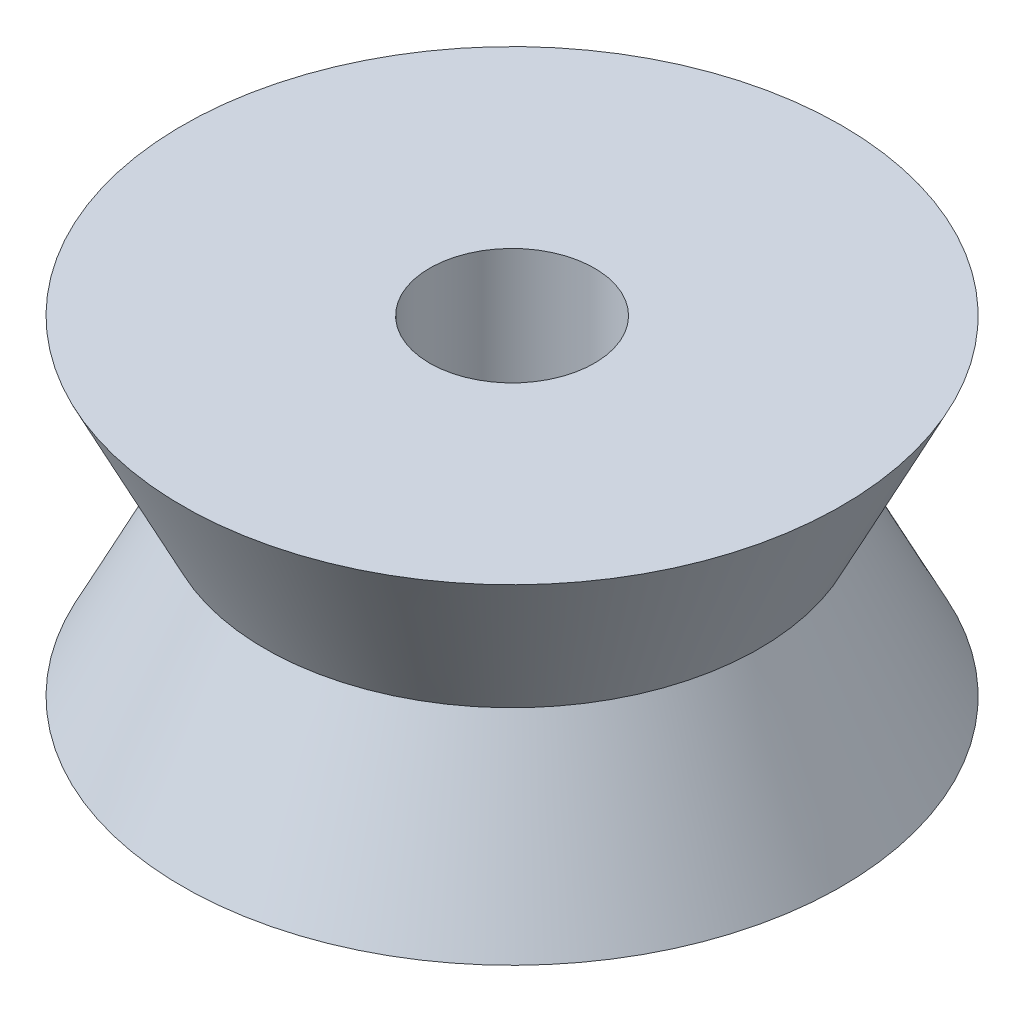
ISO-10303-21;
HEADER;
FILE_DESCRIPTION(('STEP AP214'),'2;1');
FILE_NAME('part.step','',(''),(''),'','','');
FILE_SCHEMA(('AUTOMOTIVE_DESIGN { 1 0 10303 214 1 1 1 1 }'));
ENDSEC;
DATA;
#1=APPLICATION_CONTEXT('core data for automotive mechanical design processes');
#2=APPLICATION_PROTOCOL_DEFINITION('international standard','automotive_design',2000,#1);
#3=PRODUCT_CONTEXT('',#1,'mechanical');
#4=PRODUCT('Part','Part','',(#3));
#5=PRODUCT_RELATED_PRODUCT_CATEGORY('part','',(#4));
#6=PRODUCT_DEFINITION_FORMATION('','',#4);
#7=PRODUCT_DEFINITION_CONTEXT('part definition',#1,'design');
#8=PRODUCT_DEFINITION('design','',#6,#7);
#9=PRODUCT_DEFINITION_SHAPE('','',#8);
#10=(LENGTH_UNIT() NAMED_UNIT(*) SI_UNIT(.MILLI.,.METRE.));
#11=(NAMED_UNIT(*) PLANE_ANGLE_UNIT() SI_UNIT($,.RADIAN.));
#12=(NAMED_UNIT(*) SI_UNIT($,.STERADIAN.) SOLID_ANGLE_UNIT());
#13=UNCERTAINTY_MEASURE_WITH_UNIT(LENGTH_MEASURE(1.E-05),#10,'distance_accuracy_value','');
#14=(GEOMETRIC_REPRESENTATION_CONTEXT(3) GLOBAL_UNCERTAINTY_ASSIGNED_CONTEXT((#13)) GLOBAL_UNIT_ASSIGNED_CONTEXT((#10,
#11,#12)) REPRESENTATION_CONTEXT('',''));
#15=CARTESIAN_POINT('',(0.,0.,0.));
#16=DIRECTION('',(0.,0.,1.));
#17=DIRECTION('',(1.,0.,0.));
#18=AXIS2_PLACEMENT_3D('',#15,#16,#17);
#19=CARTESIAN_POINT('',(0.,20.,0.));
#20=DIRECTION('',(0.,-1.,0.));
#21=DIRECTION('',(0.,0.,-1.));
#22=AXIS2_PLACEMENT_3D('',#19,#20,#21);
#23=PLANE('',#22);
#24=CARTESIAN_POINT('',(0.,20.,0.));
#25=DIRECTION('',(0.,1.,0.));
#26=DIRECTION('',(0.,0.,1.));
#27=AXIS2_PLACEMENT_3D('',#24,#25,#26);
#28=CIRCLE('',#27,5.);
#29=CARTESIAN_POINT('',(0.,20.,5.));
#30=VERTEX_POINT('',#29);
#31=EDGE_CURVE('E50',#30,#30,#28,.T.);
#32=ORIENTED_EDGE('',*,*,#31,.F.);
#33=EDGE_LOOP('',(#32));
#34=FACE_BOUND('',#33,.T.);
#35=CARTESIAN_POINT('',(0.,20.,0.));
#36=DIRECTION('',(0.,-1.,0.));
#37=DIRECTION('',(0.,0.,-1.));
#38=AXIS2_PLACEMENT_3D('',#35,#36,#37);
#39=CIRCLE('',#38,20.);
#40=CARTESIAN_POINT('',(0.,20.,-20.));
#41=VERTEX_POINT('',#40);
#42=EDGE_CURVE('E10',#41,#41,#39,.T.);
#43=ORIENTED_EDGE('',*,*,#42,.F.);
#44=EDGE_LOOP('',(#43));
#45=FACE_BOUND('',#44,.T.);
#46=ADVANCED_FACE('F33',(#34,#45),#23,.F.);
#47=CARTESIAN_POINT('',(0.,20.,0.));
#48=DIRECTION('',(0.,1.,0.));
#49=DIRECTION('',(0.,0.,1.));
#50=AXIS2_PLACEMENT_3D('',#47,#48,#49);
#51=CONICAL_SURFACE('',#50,20.,0.463647609000806);
#52=CARTESIAN_POINT('',(0.,10.,0.));
#53=DIRECTION('',(0.,-1.,0.));
#54=DIRECTION('',(0.,0.,-1.));
#55=AXIS2_PLACEMENT_3D('',#52,#53,#54);
#56=CIRCLE('',#55,15.);
#57=CARTESIAN_POINT('',(0.,10.,-15.));
#58=VERTEX_POINT('',#57);
#59=EDGE_CURVE('E39',#58,#58,#56,.T.);
#60=ORIENTED_EDGE('',*,*,#59,.F.);
#61=EDGE_LOOP('',(#60));
#62=FACE_BOUND('',#61,.T.);
#63=ORIENTED_EDGE('',*,*,#42,.T.);
#64=EDGE_LOOP('',(#63));
#65=FACE_BOUND('',#64,.T.);
#66=ADVANCED_FACE('F67',(#62,#65),#51,.T.);
#67=CARTESIAN_POINT('',(0.,10.,0.));
#68=DIRECTION('',(0.,-1.,0.));
#69=DIRECTION('',(0.,0.,-1.));
#70=AXIS2_PLACEMENT_3D('',#67,#68,#69);
#71=CONICAL_SURFACE('',#70,15.,0.463647609000806);
#72=CARTESIAN_POINT('',(0.,0.,0.));
#73=DIRECTION('',(0.,-1.,0.));
#74=DIRECTION('',(0.,0.,-1.));
#75=AXIS2_PLACEMENT_3D('',#72,#73,#74);
#76=CIRCLE('',#75,20.);
#77=CARTESIAN_POINT('',(0.,0.,-20.));
#78=VERTEX_POINT('',#77);
#79=EDGE_CURVE('E43',#78,#78,#76,.T.);
#80=ORIENTED_EDGE('',*,*,#79,.F.);
#81=EDGE_LOOP('',(#80));
#82=FACE_BOUND('',#81,.T.);
#83=ORIENTED_EDGE('',*,*,#59,.T.);
#84=EDGE_LOOP('',(#83));
#85=FACE_BOUND('',#84,.T.);
#86=ADVANCED_FACE('F71',(#82,#85),#71,.T.);
#87=CARTESIAN_POINT('',(0.,0.,0.));
#88=DIRECTION('',(0.,1.,0.));
#89=DIRECTION('',(0.,0.,1.));
#90=AXIS2_PLACEMENT_3D('',#87,#88,#89);
#91=PLANE('',#90);
#92=CARTESIAN_POINT('',(0.,0.,0.));
#93=DIRECTION('',(0.,1.,0.));
#94=DIRECTION('',(0.,0.,1.));
#95=AXIS2_PLACEMENT_3D('',#92,#93,#94);
#96=CIRCLE('',#95,5.);
#97=CARTESIAN_POINT('',(0.,0.,5.));
#98=VERTEX_POINT('',#97);
#99=EDGE_CURVE('E47',#98,#98,#96,.T.);
#100=ORIENTED_EDGE('',*,*,#99,.T.);
#101=EDGE_LOOP('',(#100));
#102=FACE_BOUND('',#101,.T.);
#103=ORIENTED_EDGE('',*,*,#79,.T.);
#104=EDGE_LOOP('',(#103));
#105=FACE_BOUND('',#104,.T.);
#106=ADVANCED_FACE('F56',(#102,#105),#91,.F.);
#107=CARTESIAN_POINT('',(0.,0.,0.));
#108=DIRECTION('',(0.,1.,0.));
#109=DIRECTION('',(0.,0.,1.));
#110=AXIS2_PLACEMENT_3D('',#107,#108,#109);
#111=CYLINDRICAL_SURFACE('',#110,5.);
#112=ORIENTED_EDGE('',*,*,#99,.F.);
#113=EDGE_LOOP('',(#112));
#114=FACE_BOUND('',#113,.T.);
#115=ORIENTED_EDGE('',*,*,#31,.T.);
#116=EDGE_LOOP('',(#115));
#117=FACE_BOUND('',#116,.T.);
#118=ADVANCED_FACE('F59',(#114,#117),#111,.F.);
#119=CLOSED_SHELL('',(#46,#66,#86,#106,#118));
#120=MANIFOLD_SOLID_BREP('B2',#119);
#121=ADVANCED_BREP_SHAPE_REPRESENTATION('',(#18,#120),#14);
#122=SHAPE_DEFINITION_REPRESENTATION(#9,#121);
ENDSEC;
END-ISO-10303-21;
